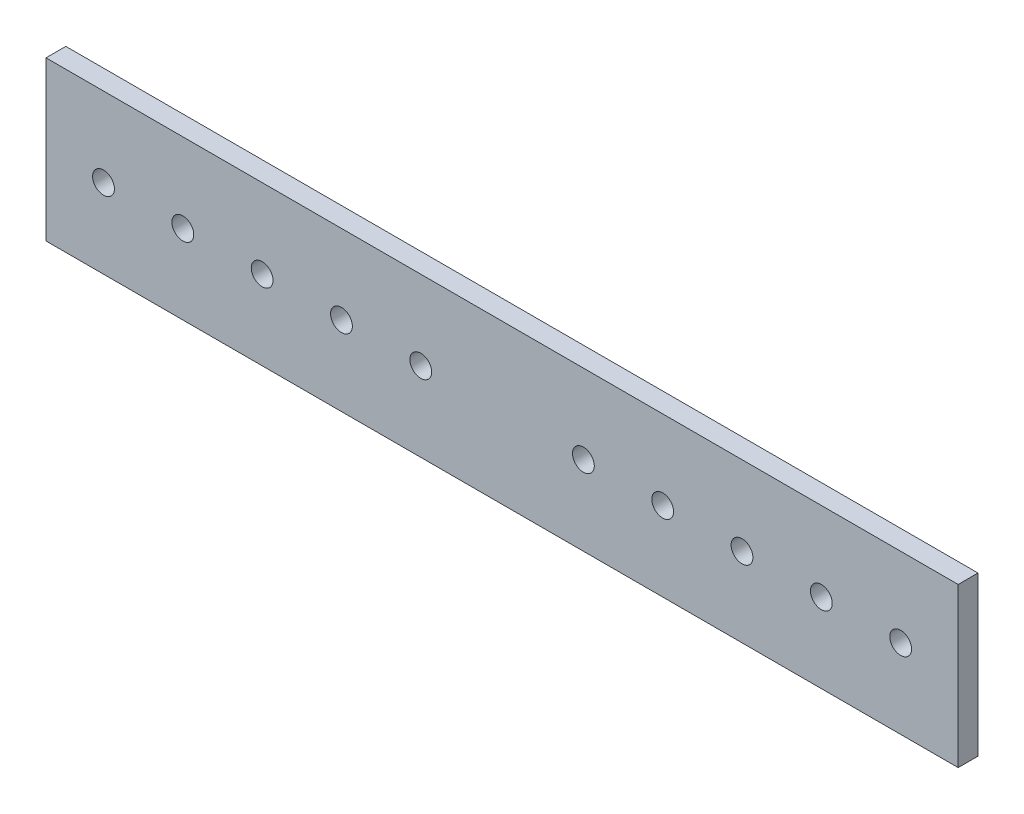
ISO-10303-21;
HEADER;
FILE_DESCRIPTION(('STEP AP214'),'2;1');
FILE_NAME('part.step','',(''),(''),'','','');
FILE_SCHEMA(('AUTOMOTIVE_DESIGN { 1 0 10303 214 1 1 1 1 }'));
ENDSEC;
DATA;
#1=APPLICATION_CONTEXT('core data for automotive mechanical design processes');
#2=APPLICATION_PROTOCOL_DEFINITION('international standard','automotive_design',2000,#1);
#3=PRODUCT_CONTEXT('',#1,'mechanical');
#4=PRODUCT('Part','Part','',(#3));
#5=PRODUCT_RELATED_PRODUCT_CATEGORY('part','',(#4));
#6=PRODUCT_DEFINITION_FORMATION('','',#4);
#7=PRODUCT_DEFINITION_CONTEXT('part definition',#1,'design');
#8=PRODUCT_DEFINITION('design','',#6,#7);
#9=PRODUCT_DEFINITION_SHAPE('','',#8);
#10=(LENGTH_UNIT() NAMED_UNIT(*) SI_UNIT(.MILLI.,.METRE.));
#11=(NAMED_UNIT(*) PLANE_ANGLE_UNIT() SI_UNIT($,.RADIAN.));
#12=(NAMED_UNIT(*) SI_UNIT($,.STERADIAN.) SOLID_ANGLE_UNIT());
#13=UNCERTAINTY_MEASURE_WITH_UNIT(LENGTH_MEASURE(1.E-05),#10,'distance_accuracy_value','');
#14=(GEOMETRIC_REPRESENTATION_CONTEXT(3) GLOBAL_UNCERTAINTY_ASSIGNED_CONTEXT((#13)) GLOBAL_UNIT_ASSIGNED_CONTEXT((#10,
#11,#12)) REPRESENTATION_CONTEXT('',''));
#15=CARTESIAN_POINT('',(0.,0.,0.));
#16=DIRECTION('',(0.,0.,1.));
#17=DIRECTION('',(1.,0.,0.));
#18=AXIS2_PLACEMENT_3D('',#15,#16,#17);
#19=CARTESIAN_POINT('',(115.,-20.,5.));
#20=DIRECTION('',(-1.,0.,0.));
#21=DIRECTION('',(0.,0.,1.));
#22=AXIS2_PLACEMENT_3D('',#19,#20,#21);
#23=PLANE('',#22);
#24=DIRECTION('',(0.,1.,0.));
#25=VECTOR('',#24,1.);
#26=CARTESIAN_POINT('',(115.,-20.,0.));
#27=LINE('',#26,#25);
#28=CARTESIAN_POINT('',(115.,-20.,0.));
#29=VERTEX_POINT('',#28);
#30=CARTESIAN_POINT('',(115.,20.,0.));
#31=VERTEX_POINT('',#30);
#32=EDGE_CURVE('E103',#29,#31,#27,.T.);
#33=ORIENTED_EDGE('',*,*,#32,.T.);
#34=DIRECTION('',(0.,0.,-1.));
#35=VECTOR('',#34,1.);
#36=CARTESIAN_POINT('',(115.,20.,5.));
#37=LINE('',#36,#35);
#38=CARTESIAN_POINT('',(115.,20.,5.));
#39=VERTEX_POINT('',#38);
#40=EDGE_CURVE('E94',#39,#31,#37,.T.);
#41=ORIENTED_EDGE('',*,*,#40,.F.);
#42=DIRECTION('',(0.,1.,0.));
#43=VECTOR('',#42,1.);
#44=CARTESIAN_POINT('',(115.,-20.,5.));
#45=LINE('',#44,#43);
#46=CARTESIAN_POINT('',(115.,-20.,5.));
#47=VERTEX_POINT('',#46);
#48=EDGE_CURVE('E88',#47,#39,#45,.T.);
#49=ORIENTED_EDGE('',*,*,#48,.F.);
#50=DIRECTION('',(0.,0.,-1.));
#51=VECTOR('',#50,1.);
#52=CARTESIAN_POINT('',(115.,-20.,5.));
#53=LINE('',#52,#51);
#54=EDGE_CURVE('E99',#47,#29,#53,.T.);
#55=ORIENTED_EDGE('',*,*,#54,.T.);
#56=EDGE_LOOP('',(#33,#41,#49,#55));
#57=FACE_BOUND('',#56,.T.);
#58=ADVANCED_FACE('F34',(#57),#23,.F.);
#59=CARTESIAN_POINT('',(-115.,20.,5.));
#60=DIRECTION('',(0.,-1.,0.));
#61=DIRECTION('',(0.,0.,-1.));
#62=AXIS2_PLACEMENT_3D('',#59,#60,#61);
#63=PLANE('',#62);
#64=DIRECTION('',(-1.,0.,0.));
#65=VECTOR('',#64,1.);
#66=CARTESIAN_POINT('',(-115.,20.,0.));
#67=LINE('',#66,#65);
#68=CARTESIAN_POINT('',(-115.,20.,0.));
#69=VERTEX_POINT('',#68);
#70=EDGE_CURVE('E93',#31,#69,#67,.T.);
#71=ORIENTED_EDGE('',*,*,#70,.T.);
#72=DIRECTION('',(0.,0.,-1.));
#73=VECTOR('',#72,1.);
#74=CARTESIAN_POINT('',(-115.,20.,5.));
#75=LINE('',#74,#73);
#76=CARTESIAN_POINT('',(-115.,20.,5.));
#77=VERTEX_POINT('',#76);
#78=EDGE_CURVE('E91',#77,#69,#75,.T.);
#79=ORIENTED_EDGE('',*,*,#78,.F.);
#80=DIRECTION('',(-1.,0.,0.));
#81=VECTOR('',#80,1.);
#82=CARTESIAN_POINT('',(-115.,20.,5.));
#83=LINE('',#82,#81);
#84=EDGE_CURVE('E82',#39,#77,#83,.T.);
#85=ORIENTED_EDGE('',*,*,#84,.F.);
#86=ORIENTED_EDGE('',*,*,#40,.T.);
#87=EDGE_LOOP('',(#71,#79,#85,#86));
#88=FACE_BOUND('',#87,.T.);
#89=ADVANCED_FACE('F92',(#88),#63,.F.);
#90=CARTESIAN_POINT('',(-115.,-20.,5.));
#91=DIRECTION('',(1.,0.,0.));
#92=DIRECTION('',(0.,0.,-1.));
#93=AXIS2_PLACEMENT_3D('',#90,#91,#92);
#94=PLANE('',#93);
#95=DIRECTION('',(0.,-1.,0.));
#96=VECTOR('',#95,1.);
#97=CARTESIAN_POINT('',(-115.,-20.,0.));
#98=LINE('',#97,#96);
#99=CARTESIAN_POINT('',(-115.,-20.,0.));
#100=VERTEX_POINT('',#99);
#101=EDGE_CURVE('E68',#69,#100,#98,.T.);
#102=ORIENTED_EDGE('',*,*,#101,.T.);
#103=DIRECTION('',(0.,0.,-1.));
#104=VECTOR('',#103,1.);
#105=CARTESIAN_POINT('',(-115.,-20.,5.));
#106=LINE('',#105,#104);
#107=CARTESIAN_POINT('',(-115.,-20.,5.));
#108=VERTEX_POINT('',#107);
#109=EDGE_CURVE('E95',#108,#100,#106,.T.);
#110=ORIENTED_EDGE('',*,*,#109,.F.);
#111=DIRECTION('',(0.,-1.,0.));
#112=VECTOR('',#111,1.);
#113=CARTESIAN_POINT('',(-115.,-20.,5.));
#114=LINE('',#113,#112);
#115=EDGE_CURVE('E86',#77,#108,#114,.T.);
#116=ORIENTED_EDGE('',*,*,#115,.F.);
#117=ORIENTED_EDGE('',*,*,#78,.T.);
#118=EDGE_LOOP('',(#102,#110,#116,#117));
#119=FACE_BOUND('',#118,.T.);
#120=ADVANCED_FACE('F97',(#119),#94,.F.);
#121=CARTESIAN_POINT('',(-115.,-20.,5.));
#122=DIRECTION('',(0.,1.,0.));
#123=DIRECTION('',(0.,0.,1.));
#124=AXIS2_PLACEMENT_3D('',#121,#122,#123);
#125=PLANE('',#124);
#126=DIRECTION('',(1.,0.,0.));
#127=VECTOR('',#126,1.);
#128=CARTESIAN_POINT('',(-115.,-20.,0.));
#129=LINE('',#128,#127);
#130=EDGE_CURVE('E74',#100,#29,#129,.T.);
#131=ORIENTED_EDGE('',*,*,#130,.T.);
#132=ORIENTED_EDGE('',*,*,#54,.F.);
#133=DIRECTION('',(1.,0.,0.));
#134=VECTOR('',#133,1.);
#135=CARTESIAN_POINT('',(-115.,-20.,5.));
#136=LINE('',#135,#134);
#137=EDGE_CURVE('E51',#108,#47,#136,.T.);
#138=ORIENTED_EDGE('',*,*,#137,.F.);
#139=ORIENTED_EDGE('',*,*,#109,.T.);
#140=EDGE_LOOP('',(#131,#132,#138,#139));
#141=FACE_BOUND('',#140,.T.);
#142=ADVANCED_FACE('F163',(#141),#125,.F.);
#143=CARTESIAN_POINT('',(0.,0.,5.));
#144=DIRECTION('',(0.,0.,-1.));
#145=DIRECTION('',(-1.,0.,0.));
#146=AXIS2_PLACEMENT_3D('',#143,#144,#145);
#147=PLANE('',#146);
#148=CARTESIAN_POINT('',(-40.5,0.,5.));
#149=DIRECTION('',(0.,0.,-1.));
#150=DIRECTION('',(-1.,0.,0.));
#151=AXIS2_PLACEMENT_3D('',#148,#149,#150);
#152=CIRCLE('',#151,2.75);
#153=CARTESIAN_POINT('',(-43.25,0.,5.));
#154=VERTEX_POINT('',#153);
#155=EDGE_CURVE('E356',#154,#154,#152,.T.);
#156=ORIENTED_EDGE('',*,*,#155,.T.);
#157=EDGE_LOOP('',(#156));
#158=FACE_BOUND('',#157,.T.);
#159=CARTESIAN_POINT('',(40.5,0.,5.));
#160=DIRECTION('',(0.,0.,1.));
#161=DIRECTION('',(1.,0.,0.));
#162=AXIS2_PLACEMENT_3D('',#159,#160,#161);
#163=CIRCLE('',#162,2.75);
#164=CARTESIAN_POINT('',(43.25,0.,5.));
#165=VERTEX_POINT('',#164);
#166=EDGE_CURVE('E313',#165,#165,#163,.T.);
#167=ORIENTED_EDGE('',*,*,#166,.F.);
#168=EDGE_LOOP('',(#167));
#169=FACE_BOUND('',#168,.T.);
#170=CARTESIAN_POINT('',(-20.5,0.,5.));
#171=DIRECTION('',(0.,0.,-1.));
#172=DIRECTION('',(-1.,0.,0.));
#173=AXIS2_PLACEMENT_3D('',#170,#171,#172);
#174=CIRCLE('',#173,2.75);
#175=CARTESIAN_POINT('',(-23.25,0.,5.));
#176=VERTEX_POINT('',#175);
#177=EDGE_CURVE('E308',#176,#176,#174,.T.);
#178=ORIENTED_EDGE('',*,*,#177,.T.);
#179=EDGE_LOOP('',(#178));
#180=FACE_BOUND('',#179,.T.);
#181=CARTESIAN_POINT('',(20.5,0.,5.));
#182=DIRECTION('',(0.,0.,1.));
#183=DIRECTION('',(1.,0.,0.));
#184=AXIS2_PLACEMENT_3D('',#181,#182,#183);
#185=CIRCLE('',#184,2.75);
#186=CARTESIAN_POINT('',(23.25,0.,5.));
#187=VERTEX_POINT('',#186);
#188=EDGE_CURVE('E315',#187,#187,#185,.T.);
#189=ORIENTED_EDGE('',*,*,#188,.F.);
#190=EDGE_LOOP('',(#189));
#191=FACE_BOUND('',#190,.T.);
#192=ORIENTED_EDGE('',*,*,#48,.T.);
#193=ORIENTED_EDGE('',*,*,#84,.T.);
#194=ORIENTED_EDGE('',*,*,#115,.T.);
#195=ORIENTED_EDGE('',*,*,#137,.T.);
#196=EDGE_LOOP('',(#192,#193,#194,#195));
#197=FACE_BOUND('',#196,.T.);
#198=CARTESIAN_POINT('',(60.5,0.,5.));
#199=DIRECTION('',(0.,0.,1.));
#200=DIRECTION('',(1.,0.,0.));
#201=AXIS2_PLACEMENT_3D('',#198,#199,#200);
#202=CIRCLE('',#201,2.75);
#203=CARTESIAN_POINT('',(63.25,0.,5.));
#204=VERTEX_POINT('',#203);
#205=EDGE_CURVE('E116',#204,#204,#202,.T.);
#206=ORIENTED_EDGE('',*,*,#205,.F.);
#207=EDGE_LOOP('',(#206));
#208=FACE_BOUND('',#207,.T.);
#209=CARTESIAN_POINT('',(80.5,0.,5.));
#210=DIRECTION('',(0.,0.,1.));
#211=DIRECTION('',(1.,0.,0.));
#212=AXIS2_PLACEMENT_3D('',#209,#210,#211);
#213=CIRCLE('',#212,2.75);
#214=CARTESIAN_POINT('',(83.25,0.,5.));
#215=VERTEX_POINT('',#214);
#216=EDGE_CURVE('E122',#215,#215,#213,.T.);
#217=ORIENTED_EDGE('',*,*,#216,.F.);
#218=EDGE_LOOP('',(#217));
#219=FACE_BOUND('',#218,.T.);
#220=CARTESIAN_POINT('',(100.5,0.,5.));
#221=DIRECTION('',(0.,0.,1.));
#222=DIRECTION('',(1.,0.,0.));
#223=AXIS2_PLACEMENT_3D('',#220,#221,#222);
#224=CIRCLE('',#223,2.75);
#225=CARTESIAN_POINT('',(103.25,0.,5.));
#226=VERTEX_POINT('',#225);
#227=EDGE_CURVE('E128',#226,#226,#224,.T.);
#228=ORIENTED_EDGE('',*,*,#227,.F.);
#229=EDGE_LOOP('',(#228));
#230=FACE_BOUND('',#229,.T.);
#231=CARTESIAN_POINT('',(-60.5,0.,5.));
#232=DIRECTION('',(0.,0.,-1.));
#233=DIRECTION('',(-1.,0.,0.));
#234=AXIS2_PLACEMENT_3D('',#231,#232,#233);
#235=CIRCLE('',#234,2.75);
#236=CARTESIAN_POINT('',(-63.25,0.,5.));
#237=VERTEX_POINT('',#236);
#238=EDGE_CURVE('E131',#237,#237,#235,.T.);
#239=ORIENTED_EDGE('',*,*,#238,.T.);
#240=EDGE_LOOP('',(#239));
#241=FACE_BOUND('',#240,.T.);
#242=CARTESIAN_POINT('',(-80.5,0.,5.));
#243=DIRECTION('',(0.,0.,-1.));
#244=DIRECTION('',(-1.,0.,0.));
#245=AXIS2_PLACEMENT_3D('',#242,#243,#244);
#246=CIRCLE('',#245,2.75);
#247=CARTESIAN_POINT('',(-83.25,0.,5.));
#248=VERTEX_POINT('',#247);
#249=EDGE_CURVE('E137',#248,#248,#246,.T.);
#250=ORIENTED_EDGE('',*,*,#249,.T.);
#251=EDGE_LOOP('',(#250));
#252=FACE_BOUND('',#251,.T.);
#253=CARTESIAN_POINT('',(-100.5,0.,5.));
#254=DIRECTION('',(0.,0.,-1.));
#255=DIRECTION('',(-1.,0.,0.));
#256=AXIS2_PLACEMENT_3D('',#253,#254,#255);
#257=CIRCLE('',#256,2.75);
#258=CARTESIAN_POINT('',(-103.25,0.,5.));
#259=VERTEX_POINT('',#258);
#260=EDGE_CURVE('E43',#259,#259,#257,.T.);
#261=ORIENTED_EDGE('',*,*,#260,.T.);
#262=EDGE_LOOP('',(#261));
#263=FACE_BOUND('',#262,.T.);
#264=ADVANCED_FACE('F83',(#158,#169,#180,#191,#197,#208,#219,#230,#241,#252,#263),#147,.F.);
#265=CARTESIAN_POINT('',(0.,0.,0.));
#266=DIRECTION('',(0.,0.,-1.));
#267=DIRECTION('',(-1.,0.,0.));
#268=AXIS2_PLACEMENT_3D('',#265,#266,#267);
#269=PLANE('',#268);
#270=CARTESIAN_POINT('',(-40.5,0.,0.));
#271=DIRECTION('',(0.,0.,-1.));
#272=DIRECTION('',(-1.,0.,0.));
#273=AXIS2_PLACEMENT_3D('',#270,#271,#272);
#274=CIRCLE('',#273,2.75);
#275=CARTESIAN_POINT('',(-43.25,0.,0.));
#276=VERTEX_POINT('',#275);
#277=EDGE_CURVE('E353',#276,#276,#274,.T.);
#278=ORIENTED_EDGE('',*,*,#277,.F.);
#279=EDGE_LOOP('',(#278));
#280=FACE_BOUND('',#279,.T.);
#281=CARTESIAN_POINT('',(40.5,0.,0.));
#282=DIRECTION('',(0.,0.,1.));
#283=DIRECTION('',(1.,0.,0.));
#284=AXIS2_PLACEMENT_3D('',#281,#282,#283);
#285=CIRCLE('',#284,2.75);
#286=CARTESIAN_POINT('',(43.25,0.,0.));
#287=VERTEX_POINT('',#286);
#288=EDGE_CURVE('E318',#287,#287,#285,.T.);
#289=ORIENTED_EDGE('',*,*,#288,.T.);
#290=EDGE_LOOP('',(#289));
#291=FACE_BOUND('',#290,.T.);
#292=CARTESIAN_POINT('',(-20.5,0.,0.));
#293=DIRECTION('',(0.,0.,-1.));
#294=DIRECTION('',(-1.,0.,0.));
#295=AXIS2_PLACEMENT_3D('',#292,#293,#294);
#296=CIRCLE('',#295,2.75);
#297=CARTESIAN_POINT('',(-23.25,0.,0.));
#298=VERTEX_POINT('',#297);
#299=EDGE_CURVE('E311',#298,#298,#296,.T.);
#300=ORIENTED_EDGE('',*,*,#299,.F.);
#301=EDGE_LOOP('',(#300));
#302=FACE_BOUND('',#301,.T.);
#303=CARTESIAN_POINT('',(20.5,0.,0.));
#304=DIRECTION('',(0.,0.,1.));
#305=DIRECTION('',(1.,0.,0.));
#306=AXIS2_PLACEMENT_3D('',#303,#304,#305);
#307=CIRCLE('',#306,2.75);
#308=CARTESIAN_POINT('',(23.25,0.,0.));
#309=VERTEX_POINT('',#308);
#310=EDGE_CURVE('E106',#309,#309,#307,.T.);
#311=ORIENTED_EDGE('',*,*,#310,.T.);
#312=EDGE_LOOP('',(#311));
#313=FACE_BOUND('',#312,.T.);
#314=ORIENTED_EDGE('',*,*,#32,.F.);
#315=ORIENTED_EDGE('',*,*,#130,.F.);
#316=ORIENTED_EDGE('',*,*,#101,.F.);
#317=ORIENTED_EDGE('',*,*,#70,.F.);
#318=EDGE_LOOP('',(#314,#315,#316,#317));
#319=FACE_BOUND('',#318,.T.);
#320=CARTESIAN_POINT('',(60.5,0.,0.));
#321=DIRECTION('',(0.,0.,1.));
#322=DIRECTION('',(1.,0.,0.));
#323=AXIS2_PLACEMENT_3D('',#320,#321,#322);
#324=CIRCLE('',#323,2.75);
#325=CARTESIAN_POINT('',(63.25,0.,0.));
#326=VERTEX_POINT('',#325);
#327=EDGE_CURVE('E113',#326,#326,#324,.T.);
#328=ORIENTED_EDGE('',*,*,#327,.T.);
#329=EDGE_LOOP('',(#328));
#330=FACE_BOUND('',#329,.T.);
#331=CARTESIAN_POINT('',(80.5,0.,0.));
#332=DIRECTION('',(0.,0.,1.));
#333=DIRECTION('',(1.,0.,0.));
#334=AXIS2_PLACEMENT_3D('',#331,#332,#333);
#335=CIRCLE('',#334,2.75);
#336=CARTESIAN_POINT('',(83.25,0.,0.));
#337=VERTEX_POINT('',#336);
#338=EDGE_CURVE('E119',#337,#337,#335,.T.);
#339=ORIENTED_EDGE('',*,*,#338,.T.);
#340=EDGE_LOOP('',(#339));
#341=FACE_BOUND('',#340,.T.);
#342=CARTESIAN_POINT('',(100.5,0.,0.));
#343=DIRECTION('',(0.,0.,1.));
#344=DIRECTION('',(1.,0.,0.));
#345=AXIS2_PLACEMENT_3D('',#342,#343,#344);
#346=CIRCLE('',#345,2.75);
#347=CARTESIAN_POINT('',(103.25,0.,0.));
#348=VERTEX_POINT('',#347);
#349=EDGE_CURVE('E125',#348,#348,#346,.T.);
#350=ORIENTED_EDGE('',*,*,#349,.T.);
#351=EDGE_LOOP('',(#350));
#352=FACE_BOUND('',#351,.T.);
#353=CARTESIAN_POINT('',(-60.5,0.,0.));
#354=DIRECTION('',(0.,0.,-1.));
#355=DIRECTION('',(-1.,0.,0.));
#356=AXIS2_PLACEMENT_3D('',#353,#354,#355);
#357=CIRCLE('',#356,2.75);
#358=CARTESIAN_POINT('',(-63.25,0.,0.));
#359=VERTEX_POINT('',#358);
#360=EDGE_CURVE('E134',#359,#359,#357,.T.);
#361=ORIENTED_EDGE('',*,*,#360,.F.);
#362=EDGE_LOOP('',(#361));
#363=FACE_BOUND('',#362,.T.);
#364=CARTESIAN_POINT('',(-80.5,0.,0.));
#365=DIRECTION('',(0.,0.,-1.));
#366=DIRECTION('',(-1.,0.,0.));
#367=AXIS2_PLACEMENT_3D('',#364,#365,#366);
#368=CIRCLE('',#367,2.75);
#369=CARTESIAN_POINT('',(-83.25,0.,0.));
#370=VERTEX_POINT('',#369);
#371=EDGE_CURVE('E140',#370,#370,#368,.T.);
#372=ORIENTED_EDGE('',*,*,#371,.F.);
#373=EDGE_LOOP('',(#372));
#374=FACE_BOUND('',#373,.T.);
#375=CARTESIAN_POINT('',(-100.5,0.,0.));
#376=DIRECTION('',(0.,0.,-1.));
#377=DIRECTION('',(-1.,0.,0.));
#378=AXIS2_PLACEMENT_3D('',#375,#376,#377);
#379=CIRCLE('',#378,2.75);
#380=CARTESIAN_POINT('',(-103.25,0.,0.));
#381=VERTEX_POINT('',#380);
#382=EDGE_CURVE('E11',#381,#381,#379,.T.);
#383=ORIENTED_EDGE('',*,*,#382,.F.);
#384=EDGE_LOOP('',(#383));
#385=FACE_BOUND('',#384,.T.);
#386=ADVANCED_FACE('F151',(#280,#291,#302,#313,#319,#330,#341,#352,#363,#374,#385),#269,.T.);
#387=CARTESIAN_POINT('',(20.5,0.,0.));
#388=DIRECTION('',(0.,0.,1.));
#389=DIRECTION('',(1.,0.,0.));
#390=AXIS2_PLACEMENT_3D('',#387,#388,#389);
#391=CYLINDRICAL_SURFACE('',#390,2.75);
#392=ORIENTED_EDGE('',*,*,#310,.F.);
#393=EDGE_LOOP('',(#392));
#394=FACE_BOUND('',#393,.T.);
#395=ORIENTED_EDGE('',*,*,#188,.T.);
#396=EDGE_LOOP('',(#395));
#397=FACE_BOUND('',#396,.T.);
#398=ADVANCED_FACE('F153',(#394,#397),#391,.F.);
#399=CARTESIAN_POINT('',(-20.5,0.,5.));
#400=DIRECTION('',(0.,0.,-1.));
#401=DIRECTION('',(-1.,0.,0.));
#402=AXIS2_PLACEMENT_3D('',#399,#400,#401);
#403=CYLINDRICAL_SURFACE('',#402,2.75);
#404=ORIENTED_EDGE('',*,*,#177,.F.);
#405=EDGE_LOOP('',(#404));
#406=FACE_BOUND('',#405,.T.);
#407=ORIENTED_EDGE('',*,*,#299,.T.);
#408=EDGE_LOOP('',(#407));
#409=FACE_BOUND('',#408,.T.);
#410=ADVANCED_FACE('F160',(#406,#409),#403,.F.);
#411=CARTESIAN_POINT('',(40.5,0.,0.));
#412=DIRECTION('',(0.,0.,1.));
#413=DIRECTION('',(1.,0.,0.));
#414=AXIS2_PLACEMENT_3D('',#411,#412,#413);
#415=CYLINDRICAL_SURFACE('',#414,2.75);
#416=ORIENTED_EDGE('',*,*,#288,.F.);
#417=EDGE_LOOP('',(#416));
#418=FACE_BOUND('',#417,.T.);
#419=ORIENTED_EDGE('',*,*,#166,.T.);
#420=EDGE_LOOP('',(#419));
#421=FACE_BOUND('',#420,.T.);
#422=ADVANCED_FACE('F182',(#418,#421),#415,.F.);
#423=CARTESIAN_POINT('',(60.5,0.,0.));
#424=DIRECTION('',(0.,0.,1.));
#425=DIRECTION('',(1.,0.,0.));
#426=AXIS2_PLACEMENT_3D('',#423,#424,#425);
#427=CYLINDRICAL_SURFACE('',#426,2.75);
#428=ORIENTED_EDGE('',*,*,#327,.F.);
#429=EDGE_LOOP('',(#428));
#430=FACE_BOUND('',#429,.T.);
#431=ORIENTED_EDGE('',*,*,#205,.T.);
#432=EDGE_LOOP('',(#431));
#433=FACE_BOUND('',#432,.T.);
#434=ADVANCED_FACE('F178',(#430,#433),#427,.F.);
#435=CARTESIAN_POINT('',(80.5,0.,0.));
#436=DIRECTION('',(0.,0.,1.));
#437=DIRECTION('',(1.,0.,0.));
#438=AXIS2_PLACEMENT_3D('',#435,#436,#437);
#439=CYLINDRICAL_SURFACE('',#438,2.75);
#440=ORIENTED_EDGE('',*,*,#338,.F.);
#441=EDGE_LOOP('',(#440));
#442=FACE_BOUND('',#441,.T.);
#443=ORIENTED_EDGE('',*,*,#216,.T.);
#444=EDGE_LOOP('',(#443));
#445=FACE_BOUND('',#444,.T.);
#446=ADVANCED_FACE('F181',(#442,#445),#439,.F.);
#447=CARTESIAN_POINT('',(100.5,0.,0.));
#448=DIRECTION('',(0.,0.,1.));
#449=DIRECTION('',(1.,0.,0.));
#450=AXIS2_PLACEMENT_3D('',#447,#448,#449);
#451=CYLINDRICAL_SURFACE('',#450,2.75);
#452=ORIENTED_EDGE('',*,*,#349,.F.);
#453=EDGE_LOOP('',(#452));
#454=FACE_BOUND('',#453,.T.);
#455=ORIENTED_EDGE('',*,*,#227,.T.);
#456=EDGE_LOOP('',(#455));
#457=FACE_BOUND('',#456,.T.);
#458=ADVANCED_FACE('F186',(#454,#457),#451,.F.);
#459=CARTESIAN_POINT('',(-40.5,0.,5.));
#460=DIRECTION('',(0.,0.,-1.));
#461=DIRECTION('',(-1.,0.,0.));
#462=AXIS2_PLACEMENT_3D('',#459,#460,#461);
#463=CYLINDRICAL_SURFACE('',#462,2.75);
#464=ORIENTED_EDGE('',*,*,#155,.F.);
#465=EDGE_LOOP('',(#464));
#466=FACE_BOUND('',#465,.T.);
#467=ORIENTED_EDGE('',*,*,#277,.T.);
#468=EDGE_LOOP('',(#467));
#469=FACE_BOUND('',#468,.T.);
#470=ADVANCED_FACE('F190',(#466,#469),#463,.F.);
#471=CARTESIAN_POINT('',(-60.5,0.,5.));
#472=DIRECTION('',(0.,0.,-1.));
#473=DIRECTION('',(-1.,0.,0.));
#474=AXIS2_PLACEMENT_3D('',#471,#472,#473);
#475=CYLINDRICAL_SURFACE('',#474,2.75);
#476=ORIENTED_EDGE('',*,*,#238,.F.);
#477=EDGE_LOOP('',(#476));
#478=FACE_BOUND('',#477,.T.);
#479=ORIENTED_EDGE('',*,*,#360,.T.);
#480=EDGE_LOOP('',(#479));
#481=FACE_BOUND('',#480,.T.);
#482=ADVANCED_FACE('F192',(#478,#481),#475,.F.);
#483=CARTESIAN_POINT('',(-80.5,0.,5.));
#484=DIRECTION('',(0.,0.,-1.));
#485=DIRECTION('',(-1.,0.,0.));
#486=AXIS2_PLACEMENT_3D('',#483,#484,#485);
#487=CYLINDRICAL_SURFACE('',#486,2.75);
#488=ORIENTED_EDGE('',*,*,#249,.F.);
#489=EDGE_LOOP('',(#488));
#490=FACE_BOUND('',#489,.T.);
#491=ORIENTED_EDGE('',*,*,#371,.T.);
#492=EDGE_LOOP('',(#491));
#493=FACE_BOUND('',#492,.T.);
#494=ADVANCED_FACE('F148',(#490,#493),#487,.F.);
#495=CARTESIAN_POINT('',(-100.5,0.,5.));
#496=DIRECTION('',(0.,0.,-1.));
#497=DIRECTION('',(-1.,0.,0.));
#498=AXIS2_PLACEMENT_3D('',#495,#496,#497);
#499=CYLINDRICAL_SURFACE('',#498,2.75);
#500=ORIENTED_EDGE('',*,*,#260,.F.);
#501=EDGE_LOOP('',(#500));
#502=FACE_BOUND('',#501,.T.);
#503=ORIENTED_EDGE('',*,*,#382,.T.);
#504=EDGE_LOOP('',(#503));
#505=FACE_BOUND('',#504,.T.);
#506=ADVANCED_FACE('F36',(#502,#505),#499,.F.);
#507=CLOSED_SHELL('',(#58,#89,#120,#142,#264,#386,#398,#410,#422,#434,#446,#458,#470,#482,#494,#506));
#508=MANIFOLD_SOLID_BREP('B2',#507);
#509=ADVANCED_BREP_SHAPE_REPRESENTATION('',(#18,#508),#14);
#510=SHAPE_DEFINITION_REPRESENTATION(#9,#509);
ENDSEC;
END-ISO-10303-21;
